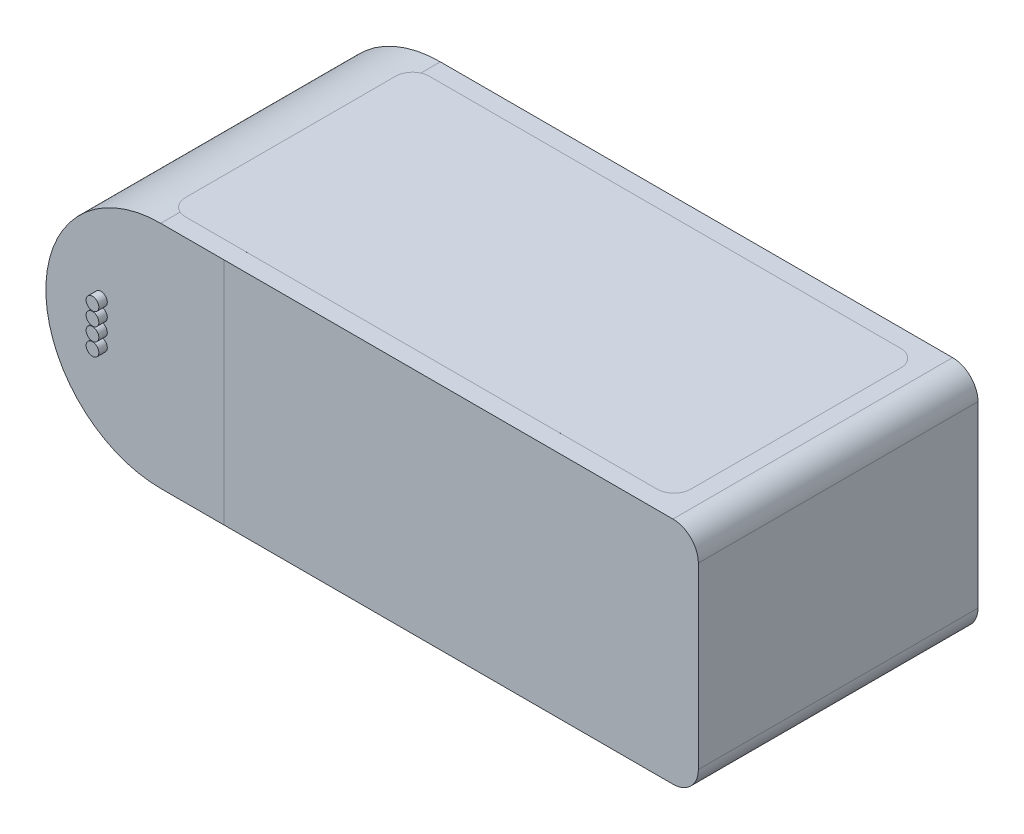
ISO-10303-21;
HEADER;
FILE_DESCRIPTION(('STEP AP214'),'2;1');
FILE_NAME('part.step','',(''),(''),'','','');
FILE_SCHEMA(('AUTOMOTIVE_DESIGN { 1 0 10303 214 1 1 1 1 }'));
ENDSEC;
DATA;
#1=APPLICATION_CONTEXT('core data for automotive mechanical design processes');
#2=APPLICATION_PROTOCOL_DEFINITION('international standard','automotive_design',2000,#1);
#3=PRODUCT_CONTEXT('',#1,'mechanical');
#4=PRODUCT('Part','Part','',(#3));
#5=PRODUCT_RELATED_PRODUCT_CATEGORY('part','',(#4));
#6=PRODUCT_DEFINITION_FORMATION('','',#4);
#7=PRODUCT_DEFINITION_CONTEXT('part definition',#1,'design');
#8=PRODUCT_DEFINITION('design','',#6,#7);
#9=PRODUCT_DEFINITION_SHAPE('','',#8);
#10=(LENGTH_UNIT() NAMED_UNIT(*) SI_UNIT(.MILLI.,.METRE.));
#11=(NAMED_UNIT(*) PLANE_ANGLE_UNIT() SI_UNIT($,.RADIAN.));
#12=(NAMED_UNIT(*) SI_UNIT($,.STERADIAN.) SOLID_ANGLE_UNIT());
#13=UNCERTAINTY_MEASURE_WITH_UNIT(LENGTH_MEASURE(1.E-05),#10,'distance_accuracy_value','');
#14=(GEOMETRIC_REPRESENTATION_CONTEXT(3) GLOBAL_UNCERTAINTY_ASSIGNED_CONTEXT((#13)) GLOBAL_UNIT_ASSIGNED_CONTEXT((#10,
#11,#12)) REPRESENTATION_CONTEXT('',''));
#15=CARTESIAN_POINT('',(0.,0.,0.));
#16=DIRECTION('',(0.,0.,1.));
#17=DIRECTION('',(1.,0.,0.));
#18=AXIS2_PLACEMENT_3D('',#15,#16,#17);
#19=CARTESIAN_POINT('',(0.,13.55,0.));
#20=DIRECTION('',(0.,-1.,0.));
#21=DIRECTION('',(0.,0.,-1.));
#22=AXIS2_PLACEMENT_3D('',#19,#20,#21);
#23=PLANE('',#22);
#24=CARTESIAN_POINT('',(-24.12,13.55,-12.381));
#25=DIRECTION('',(0.,1.,0.));
#26=DIRECTION('',(0.,0.,1.));
#27=AXIS2_PLACEMENT_3D('',#24,#25,#26);
#28=CIRCLE('',#27,2.);
#29=CARTESIAN_POINT('',(-24.12,13.55,-14.381));
#30=VERTEX_POINT('',#29);
#31=CARTESIAN_POINT('',(-24.95,13.55,-14.2006428220945));
#32=VERTEX_POINT('',#31);
#33=EDGE_CURVE('E69',#30,#32,#28,.T.);
#34=ORIENTED_EDGE('',*,*,#33,.F.);
#35=DIRECTION('',(-1.,0.,0.));
#36=VECTOR('',#35,1.);
#37=CARTESIAN_POINT('',(-24.12,13.55,-14.381));
#38=LINE('',#37,#36);
#39=CARTESIAN_POINT('',(31.5,13.55,-14.381));
#40=VERTEX_POINT('',#39);
#41=EDGE_CURVE('E73',#40,#30,#38,.T.);
#42=ORIENTED_EDGE('',*,*,#41,.F.);
#43=CARTESIAN_POINT('',(31.5,13.55,-12.381));
#44=DIRECTION('',(0.,1.,0.));
#45=DIRECTION('',(0.,0.,-1.));
#46=AXIS2_PLACEMENT_3D('',#43,#44,#45);
#47=CIRCLE('',#46,2.);
#48=CARTESIAN_POINT('',(33.5,13.55,-12.381));
#49=VERTEX_POINT('',#48);
#50=EDGE_CURVE('E208',#49,#40,#47,.T.);
#51=ORIENTED_EDGE('',*,*,#50,.F.);
#52=DIRECTION('',(0.,0.,-1.));
#53=VECTOR('',#52,1.);
#54=CARTESIAN_POINT('',(33.5,13.55,-12.381));
#55=LINE('',#54,#53);
#56=CARTESIAN_POINT('',(33.5,13.55,12.381));
#57=VERTEX_POINT('',#56);
#58=EDGE_CURVE('E205',#57,#49,#55,.T.);
#59=ORIENTED_EDGE('',*,*,#58,.F.);
#60=CARTESIAN_POINT('',(31.5,13.55,12.381));
#61=DIRECTION('',(0.,1.,0.));
#62=DIRECTION('',(0.,0.,1.));
#63=AXIS2_PLACEMENT_3D('',#60,#61,#62);
#64=CIRCLE('',#63,2.);
#65=CARTESIAN_POINT('',(31.5,13.55,14.381));
#66=VERTEX_POINT('',#65);
#67=EDGE_CURVE('E421',#66,#57,#64,.T.);
#68=ORIENTED_EDGE('',*,*,#67,.F.);
#69=DIRECTION('',(1.,0.,0.));
#70=VECTOR('',#69,1.);
#71=CARTESIAN_POINT('',(-24.12,13.55,14.381));
#72=LINE('',#71,#70);
#73=CARTESIAN_POINT('',(-24.12,13.55,14.381));
#74=VERTEX_POINT('',#73);
#75=EDGE_CURVE('E417',#74,#66,#72,.T.);
#76=ORIENTED_EDGE('',*,*,#75,.F.);
#77=CARTESIAN_POINT('',(-24.12,13.55,12.381));
#78=DIRECTION('',(0.,-1.,0.));
#79=DIRECTION('',(0.,0.,-1.));
#80=AXIS2_PLACEMENT_3D('',#77,#78,#79);
#81=CIRCLE('',#80,2.);
#82=CARTESIAN_POINT('',(-24.95,13.55,14.2006428220945));
#83=VERTEX_POINT('',#82);
#84=EDGE_CURVE('E11',#83,#74,#81,.F.);
#85=ORIENTED_EDGE('',*,*,#84,.F.);
#86=DIRECTION('',(0.,0.,1.));
#87=VECTOR('',#86,1.);
#88=CARTESIAN_POINT('',(-24.95,13.55,0.));
#89=LINE('',#88,#87);
#90=CARTESIAN_POINT('',(-24.95,13.55,16.501));
#91=VERTEX_POINT('',#90);
#92=EDGE_CURVE('E333',#83,#91,#89,.T.);
#93=ORIENTED_EDGE('',*,*,#92,.T.);
#94=DIRECTION('',(-1.,0.,0.));
#95=VECTOR('',#94,1.);
#96=CARTESIAN_POINT('',(-17.5,13.55,16.501));
#97=LINE('',#96,#95);
#98=CARTESIAN_POINT('',(-17.5,13.55,16.501));
#99=VERTEX_POINT('',#98);
#100=EDGE_CURVE('E256',#99,#91,#97,.T.);
#101=ORIENTED_EDGE('',*,*,#100,.F.);
#102=DIRECTION('',(0.,0.,-1.));
#103=VECTOR('',#102,1.);
#104=CARTESIAN_POINT('',(-17.5,13.55,16.501));
#105=LINE('',#104,#103);
#106=CARTESIAN_POINT('',(-17.5,13.55,16.5));
#107=VERTEX_POINT('',#106);
#108=EDGE_CURVE('E264',#99,#107,#105,.T.);
#109=ORIENTED_EDGE('',*,*,#108,.T.);
#110=DIRECTION('',(1.,0.,0.));
#111=VECTOR('',#110,1.);
#112=CARTESIAN_POINT('',(-38.5,13.55,16.5));
#113=LINE('',#112,#111);
#114=CARTESIAN_POINT('',(35.5,13.55,16.5));
#115=VERTEX_POINT('',#114);
#116=EDGE_CURVE('E317',#107,#115,#113,.T.);
#117=ORIENTED_EDGE('',*,*,#116,.T.);
#118=DIRECTION('',(0.,0.,-1.));
#119=VECTOR('',#118,1.);
#120=CARTESIAN_POINT('',(35.5,13.55,0.));
#121=LINE('',#120,#119);
#122=CARTESIAN_POINT('',(35.5,13.55,-16.5));
#123=VERTEX_POINT('',#122);
#124=EDGE_CURVE('E62',#115,#123,#121,.T.);
#125=ORIENTED_EDGE('',*,*,#124,.T.);
#126=DIRECTION('',(-1.,0.,0.));
#127=VECTOR('',#126,1.);
#128=CARTESIAN_POINT('',(-38.5,13.55,-16.5));
#129=LINE('',#128,#127);
#130=CARTESIAN_POINT('',(-17.5,13.55,-16.5));
#131=VERTEX_POINT('',#130);
#132=EDGE_CURVE('E313',#123,#131,#129,.T.);
#133=ORIENTED_EDGE('',*,*,#132,.T.);
#134=DIRECTION('',(0.,0.,1.));
#135=VECTOR('',#134,1.);
#136=CARTESIAN_POINT('',(-17.5,13.55,-16.501));
#137=LINE('',#136,#135);
#138=CARTESIAN_POINT('',(-17.5,13.55,-16.501));
#139=VERTEX_POINT('',#138);
#140=EDGE_CURVE('E239',#139,#131,#137,.T.);
#141=ORIENTED_EDGE('',*,*,#140,.F.);
#142=DIRECTION('',(-1.,0.,0.));
#143=VECTOR('',#142,1.);
#144=CARTESIAN_POINT('',(-17.5,13.55,-16.501));
#145=LINE('',#144,#143);
#146=CARTESIAN_POINT('',(-24.95,13.55,-16.501));
#147=VERTEX_POINT('',#146);
#148=EDGE_CURVE('E227',#139,#147,#145,.T.);
#149=ORIENTED_EDGE('',*,*,#148,.T.);
#150=EDGE_CURVE('E334',#147,#32,#89,.T.);
#151=ORIENTED_EDGE('',*,*,#150,.T.);
#152=EDGE_LOOP('',(#34,#42,#51,#59,#68,#76,#85,#93,#101,#109,#117,#125,#133,#141,#149,#151));
#153=FACE_BOUND('',#152,.T.);
#154=ADVANCED_FACE('F53',(#153),#23,.F.);
#155=CARTESIAN_POINT('',(-38.5,13.55,16.5));
#156=DIRECTION('',(0.,0.,-1.));
#157=DIRECTION('',(-1.,0.,0.));
#158=AXIS2_PLACEMENT_3D('',#155,#156,#157);
#159=PLANE('',#158);
#160=DIRECTION('',(0.,1.,0.));
#161=VECTOR('',#160,1.);
#162=CARTESIAN_POINT('',(-17.5,-13.55,16.5));
#163=LINE('',#162,#161);
#164=CARTESIAN_POINT('',(-17.5,-13.55,16.5));
#165=VERTEX_POINT('',#164);
#166=EDGE_CURVE('E248',#165,#107,#163,.T.);
#167=ORIENTED_EDGE('',*,*,#166,.F.);
#168=DIRECTION('',(1.,0.,0.));
#169=VECTOR('',#168,1.);
#170=CARTESIAN_POINT('',(-38.5,-13.55,16.5));
#171=LINE('',#170,#169);
#172=CARTESIAN_POINT('',(35.5,-13.55,16.5));
#173=VERTEX_POINT('',#172);
#174=EDGE_CURVE('E318',#165,#173,#171,.T.);
#175=ORIENTED_EDGE('',*,*,#174,.T.);
#176=CARTESIAN_POINT('',(35.5,-10.55,16.5));
#177=DIRECTION('',(0.,0.,-1.));
#178=DIRECTION('',(-1.,0.,0.));
#179=AXIS2_PLACEMENT_3D('',#176,#177,#178);
#180=CIRCLE('',#179,3.);
#181=CARTESIAN_POINT('',(38.5,-10.55,16.5));
#182=VERTEX_POINT('',#181);
#183=EDGE_CURVE('E362',#173,#182,#180,.F.);
#184=ORIENTED_EDGE('',*,*,#183,.T.);
#185=DIRECTION('',(0.,-1.,0.));
#186=VECTOR('',#185,1.);
#187=CARTESIAN_POINT('',(38.5,13.55,16.5));
#188=LINE('',#187,#186);
#189=CARTESIAN_POINT('',(38.5,10.55,16.5));
#190=VERTEX_POINT('',#189);
#191=EDGE_CURVE('E321',#190,#182,#188,.T.);
#192=ORIENTED_EDGE('',*,*,#191,.F.);
#193=CARTESIAN_POINT('',(35.5,10.55,16.5));
#194=DIRECTION('',(0.,0.,-1.));
#195=DIRECTION('',(-1.,0.,0.));
#196=AXIS2_PLACEMENT_3D('',#193,#194,#195);
#197=CIRCLE('',#196,3.);
#198=EDGE_CURVE('E358',#190,#115,#197,.F.);
#199=ORIENTED_EDGE('',*,*,#198,.T.);
#200=ORIENTED_EDGE('',*,*,#116,.F.);
#201=EDGE_LOOP('',(#167,#175,#184,#192,#199,#200));
#202=FACE_BOUND('',#201,.T.);
#203=ADVANCED_FACE('F501',(#202),#159,.F.);
#204=CARTESIAN_POINT('',(-24.95,0.,-16.5));
#205=DIRECTION('',(0.,0.,1.));
#206=DIRECTION('',(1.,0.,0.));
#207=AXIS2_PLACEMENT_3D('',#204,#205,#206);
#208=CYLINDRICAL_SURFACE('',#207,13.55);
#209=ORIENTED_EDGE('',*,*,#150,.F.);
#210=CARTESIAN_POINT('',(-24.95,0.,-16.501));
#211=DIRECTION('',(0.,0.,1.));
#212=DIRECTION('',(1.,0.,0.));
#213=AXIS2_PLACEMENT_3D('',#210,#211,#212);
#214=CIRCLE('',#213,13.55);
#215=CARTESIAN_POINT('',(-24.95,-13.55,-16.501));
#216=VERTEX_POINT('',#215);
#217=EDGE_CURVE('E223',#147,#216,#214,.T.);
#218=ORIENTED_EDGE('',*,*,#217,.T.);
#219=DIRECTION('',(0.,0.,-1.));
#220=VECTOR('',#219,1.);
#221=CARTESIAN_POINT('',(-24.95,-13.55,-16.5));
#222=LINE('',#221,#220);
#223=CARTESIAN_POINT('',(-24.95,-13.55,16.501));
#224=VERTEX_POINT('',#223);
#225=EDGE_CURVE('E337',#224,#216,#222,.T.);
#226=ORIENTED_EDGE('',*,*,#225,.F.);
#227=CARTESIAN_POINT('',(-24.95,0.,16.501));
#228=DIRECTION('',(0.,0.,1.));
#229=DIRECTION('',(1.,0.,0.));
#230=AXIS2_PLACEMENT_3D('',#227,#228,#229);
#231=CIRCLE('',#230,13.55);
#232=EDGE_CURVE('E260',#91,#224,#231,.T.);
#233=ORIENTED_EDGE('',*,*,#232,.F.);
#234=ORIENTED_EDGE('',*,*,#92,.F.);
#235=EDGE_CURVE('E338',#32,#83,#89,.T.);
#236=ORIENTED_EDGE('',*,*,#235,.F.);
#237=EDGE_LOOP('',(#209,#218,#226,#233,#234,#236));
#238=FACE_BOUND('',#237,.T.);
#239=ADVANCED_FACE('F390',(#238),#208,.T.);
#240=CARTESIAN_POINT('',(38.5,13.55,16.5));
#241=DIRECTION('',(-1.,0.,0.));
#242=DIRECTION('',(0.,0.,1.));
#243=AXIS2_PLACEMENT_3D('',#240,#241,#242);
#244=PLANE('',#243);
#245=ORIENTED_EDGE('',*,*,#191,.T.);
#246=DIRECTION('',(0.,0.,-1.));
#247=VECTOR('',#246,1.);
#248=CARTESIAN_POINT('',(38.5,-10.55,-16.5));
#249=LINE('',#248,#247);
#250=CARTESIAN_POINT('',(38.5,-10.55,-16.5));
#251=VERTEX_POINT('',#250);
#252=EDGE_CURVE('E344',#182,#251,#249,.T.);
#253=ORIENTED_EDGE('',*,*,#252,.T.);
#254=DIRECTION('',(0.,-1.,0.));
#255=VECTOR('',#254,1.);
#256=CARTESIAN_POINT('',(38.5,13.55,-16.5));
#257=LINE('',#256,#255);
#258=CARTESIAN_POINT('',(38.5,10.55,-16.5));
#259=VERTEX_POINT('',#258);
#260=EDGE_CURVE('E329',#259,#251,#257,.T.);
#261=ORIENTED_EDGE('',*,*,#260,.F.);
#262=DIRECTION('',(0.,0.,-1.));
#263=VECTOR('',#262,1.);
#264=CARTESIAN_POINT('',(38.5,10.55,16.5));
#265=LINE('',#264,#263);
#266=EDGE_CURVE('E341',#259,#190,#265,.F.);
#267=ORIENTED_EDGE('',*,*,#266,.T.);
#268=EDGE_LOOP('',(#245,#253,#261,#267));
#269=FACE_BOUND('',#268,.T.);
#270=ADVANCED_FACE('F508',(#269),#244,.F.);
#271=CARTESIAN_POINT('',(-38.5,13.55,-16.5));
#272=DIRECTION('',(0.,0.,1.));
#273=DIRECTION('',(1.,0.,0.));
#274=AXIS2_PLACEMENT_3D('',#271,#272,#273);
#275=PLANE('',#274);
#276=DIRECTION('',(-1.,0.,0.));
#277=VECTOR('',#276,1.);
#278=CARTESIAN_POINT('',(-38.5,-13.55,-16.5));
#279=LINE('',#278,#277);
#280=CARTESIAN_POINT('',(35.5,-13.55,-16.5));
#281=VERTEX_POINT('',#280);
#282=CARTESIAN_POINT('',(-17.5,-13.55,-16.5));
#283=VERTEX_POINT('',#282);
#284=EDGE_CURVE('E312',#281,#283,#279,.T.);
#285=ORIENTED_EDGE('',*,*,#284,.T.);
#286=DIRECTION('',(0.,1.,0.));
#287=VECTOR('',#286,1.);
#288=CARTESIAN_POINT('',(-17.5,-13.55,-16.5));
#289=LINE('',#288,#287);
#290=EDGE_CURVE('E210',#283,#131,#289,.T.);
#291=ORIENTED_EDGE('',*,*,#290,.T.);
#292=ORIENTED_EDGE('',*,*,#132,.F.);
#293=CARTESIAN_POINT('',(35.5,10.55,-16.5));
#294=DIRECTION('',(0.,0.,1.));
#295=DIRECTION('',(1.,0.,0.));
#296=AXIS2_PLACEMENT_3D('',#293,#294,#295);
#297=CIRCLE('',#296,3.);
#298=EDGE_CURVE('E348',#123,#259,#297,.F.);
#299=ORIENTED_EDGE('',*,*,#298,.T.);
#300=ORIENTED_EDGE('',*,*,#260,.T.);
#301=CARTESIAN_POINT('',(35.5,-10.55,-16.5));
#302=DIRECTION('',(0.,0.,1.));
#303=DIRECTION('',(1.,0.,0.));
#304=AXIS2_PLACEMENT_3D('',#301,#302,#303);
#305=CIRCLE('',#304,3.);
#306=EDGE_CURVE('E351',#251,#281,#305,.F.);
#307=ORIENTED_EDGE('',*,*,#306,.T.);
#308=EDGE_LOOP('',(#285,#291,#292,#299,#300,#307));
#309=FACE_BOUND('',#308,.T.);
#310=ADVANCED_FACE('F506',(#309),#275,.F.);
#311=CARTESIAN_POINT('',(0.,-13.55,0.));
#312=DIRECTION('',(0.,-1.,0.));
#313=DIRECTION('',(0.,0.,-1.));
#314=AXIS2_PLACEMENT_3D('',#311,#312,#313);
#315=PLANE('',#314);
#316=ORIENTED_EDGE('',*,*,#284,.F.);
#317=DIRECTION('',(0.,0.,-1.));
#318=VECTOR('',#317,1.);
#319=CARTESIAN_POINT('',(35.5,-13.55,16.5));
#320=LINE('',#319,#318);
#321=EDGE_CURVE('E354',#281,#173,#320,.F.);
#322=ORIENTED_EDGE('',*,*,#321,.T.);
#323=ORIENTED_EDGE('',*,*,#174,.F.);
#324=DIRECTION('',(0.,0.,-1.));
#325=VECTOR('',#324,1.);
#326=CARTESIAN_POINT('',(-17.5,-13.55,16.501));
#327=LINE('',#326,#325);
#328=CARTESIAN_POINT('',(-17.5,-13.55,16.501));
#329=VERTEX_POINT('',#328);
#330=EDGE_CURVE('E271',#329,#165,#327,.T.);
#331=ORIENTED_EDGE('',*,*,#330,.F.);
#332=DIRECTION('',(1.,0.,0.));
#333=VECTOR('',#332,1.);
#334=CARTESIAN_POINT('',(-24.95,-13.55,16.501));
#335=LINE('',#334,#333);
#336=EDGE_CURVE('E249',#224,#329,#335,.T.);
#337=ORIENTED_EDGE('',*,*,#336,.F.);
#338=ORIENTED_EDGE('',*,*,#225,.T.);
#339=DIRECTION('',(1.,0.,0.));
#340=VECTOR('',#339,1.);
#341=CARTESIAN_POINT('',(-24.95,-13.55,-16.501));
#342=LINE('',#341,#340);
#343=CARTESIAN_POINT('',(-17.5,-13.55,-16.501));
#344=VERTEX_POINT('',#343);
#345=EDGE_CURVE('E214',#216,#344,#342,.T.);
#346=ORIENTED_EDGE('',*,*,#345,.T.);
#347=DIRECTION('',(0.,0.,1.));
#348=VECTOR('',#347,1.);
#349=CARTESIAN_POINT('',(-17.5,-13.55,-16.501));
#350=LINE('',#349,#348);
#351=EDGE_CURVE('E234',#344,#283,#350,.T.);
#352=ORIENTED_EDGE('',*,*,#351,.T.);
#353=EDGE_LOOP('',(#316,#322,#323,#331,#337,#338,#346,#352));
#354=FACE_BOUND('',#353,.T.);
#355=ADVANCED_FACE('F491',(#354),#315,.T.);
#356=CARTESIAN_POINT('',(35.5,-10.55,16.5));
#357=DIRECTION('',(0.,0.,1.));
#358=DIRECTION('',(1.,0.,0.));
#359=AXIS2_PLACEMENT_3D('',#356,#357,#358);
#360=CYLINDRICAL_SURFACE('',#359,3.);
#361=ORIENTED_EDGE('',*,*,#183,.F.);
#362=ORIENTED_EDGE('',*,*,#321,.F.);
#363=ORIENTED_EDGE('',*,*,#306,.F.);
#364=ORIENTED_EDGE('',*,*,#252,.F.);
#365=EDGE_LOOP('',(#361,#362,#363,#364));
#366=FACE_BOUND('',#365,.T.);
#367=ADVANCED_FACE('F512',(#366),#360,.T.);
#368=CARTESIAN_POINT('',(35.5,10.55,0.));
#369=DIRECTION('',(0.,0.,-1.));
#370=DIRECTION('',(-1.,0.,0.));
#371=AXIS2_PLACEMENT_3D('',#368,#369,#370);
#372=CYLINDRICAL_SURFACE('',#371,3.);
#373=ORIENTED_EDGE('',*,*,#198,.F.);
#374=ORIENTED_EDGE('',*,*,#266,.F.);
#375=ORIENTED_EDGE('',*,*,#298,.F.);
#376=ORIENTED_EDGE('',*,*,#124,.F.);
#377=EDGE_LOOP('',(#373,#374,#375,#376));
#378=FACE_BOUND('',#377,.T.);
#379=ADVANCED_FACE('F55',(#378),#372,.T.);
#380=CARTESIAN_POINT('',(-17.5,-13.55,16.501));
#381=DIRECTION('',(-1.,0.,0.));
#382=DIRECTION('',(0.,0.,1.));
#383=AXIS2_PLACEMENT_3D('',#380,#381,#382);
#384=PLANE('',#383);
#385=ORIENTED_EDGE('',*,*,#166,.T.);
#386=ORIENTED_EDGE('',*,*,#108,.F.);
#387=DIRECTION('',(0.,1.,0.));
#388=VECTOR('',#387,1.);
#389=CARTESIAN_POINT('',(-17.5,-13.55,16.501));
#390=LINE('',#389,#388);
#391=EDGE_CURVE('E253',#329,#99,#390,.T.);
#392=ORIENTED_EDGE('',*,*,#391,.F.);
#393=ORIENTED_EDGE('',*,*,#330,.T.);
#394=EDGE_LOOP('',(#385,#386,#392,#393));
#395=FACE_BOUND('',#394,.T.);
#396=ADVANCED_FACE('F494',(#395),#384,.F.);
#397=CARTESIAN_POINT('',(-24.95,0.,16.501));
#398=DIRECTION('',(0.,0.,1.));
#399=DIRECTION('',(1.,0.,0.));
#400=AXIS2_PLACEMENT_3D('',#397,#398,#399);
#401=PLANE('',#400);
#402=CARTESIAN_POINT('',(-32.,2.325,16.501));
#403=DIRECTION('',(0.,0.,1.));
#404=DIRECTION('',(1.,0.,0.));
#405=AXIS2_PLACEMENT_3D('',#402,#403,#404);
#406=CIRCLE('',#405,0.749999999999984);
#407=CARTESIAN_POINT('',(-31.25,2.325,16.501));
#408=VERTEX_POINT('',#407);
#409=EDGE_CURVE('E284',#408,#408,#406,.T.);
#410=ORIENTED_EDGE('',*,*,#409,.F.);
#411=EDGE_LOOP('',(#410));
#412=FACE_BOUND('',#411,.T.);
#413=CARTESIAN_POINT('',(-32.,0.775,16.501));
#414=DIRECTION('',(0.,0.,1.));
#415=DIRECTION('',(1.,0.,0.));
#416=AXIS2_PLACEMENT_3D('',#413,#414,#415);
#417=CIRCLE('',#416,0.749999999999984);
#418=CARTESIAN_POINT('',(-31.25,0.775,16.501));
#419=VERTEX_POINT('',#418);
#420=EDGE_CURVE('E280',#419,#419,#417,.T.);
#421=ORIENTED_EDGE('',*,*,#420,.F.);
#422=EDGE_LOOP('',(#421));
#423=FACE_BOUND('',#422,.T.);
#424=CARTESIAN_POINT('',(-32.,-0.775,16.501));
#425=DIRECTION('',(0.,0.,1.));
#426=DIRECTION('',(1.,0.,0.));
#427=AXIS2_PLACEMENT_3D('',#424,#425,#426);
#428=CIRCLE('',#427,0.749999999999984);
#429=CARTESIAN_POINT('',(-31.25,-0.775,16.501));
#430=VERTEX_POINT('',#429);
#431=EDGE_CURVE('E276',#430,#430,#428,.T.);
#432=ORIENTED_EDGE('',*,*,#431,.F.);
#433=EDGE_LOOP('',(#432));
#434=FACE_BOUND('',#433,.T.);
#435=CARTESIAN_POINT('',(-32.,-2.325,16.501));
#436=DIRECTION('',(0.,0.,1.));
#437=DIRECTION('',(1.,0.,0.));
#438=AXIS2_PLACEMENT_3D('',#435,#436,#437);
#439=CIRCLE('',#438,0.749999999999984);
#440=CARTESIAN_POINT('',(-31.25,-2.325,16.501));
#441=VERTEX_POINT('',#440);
#442=EDGE_CURVE('E275',#441,#441,#439,.T.);
#443=ORIENTED_EDGE('',*,*,#442,.F.);
#444=EDGE_LOOP('',(#443));
#445=FACE_BOUND('',#444,.T.);
#446=ORIENTED_EDGE('',*,*,#336,.T.);
#447=ORIENTED_EDGE('',*,*,#391,.T.);
#448=ORIENTED_EDGE('',*,*,#100,.T.);
#449=ORIENTED_EDGE('',*,*,#232,.T.);
#450=EDGE_LOOP('',(#446,#447,#448,#449));
#451=FACE_BOUND('',#450,.T.);
#452=ADVANCED_FACE('F488',(#412,#423,#434,#445,#451),#401,.T.);
#453=CARTESIAN_POINT('',(-32.,-0.775,17.5));
#454=DIRECTION('',(0.,0.,1.));
#455=DIRECTION('',(1.,0.,0.));
#456=AXIS2_PLACEMENT_3D('',#453,#454,#455);
#457=PLANE('',#456);
#458=CARTESIAN_POINT('',(-32.,-0.775,17.5));
#459=DIRECTION('',(0.,0.,1.));
#460=DIRECTION('',(1.,0.,0.));
#461=AXIS2_PLACEMENT_3D('',#458,#459,#460);
#462=CIRCLE('',#461,0.749999999999984);
#463=CARTESIAN_POINT('',(-31.25,-0.775,17.5));
#464=VERTEX_POINT('',#463);
#465=EDGE_CURVE('E300',#464,#464,#462,.T.);
#466=ORIENTED_EDGE('',*,*,#465,.T.);
#467=EDGE_LOOP('',(#466));
#468=FACE_BOUND('',#467,.T.);
#469=ADVANCED_FACE('F564',(#468),#457,.T.);
#470=CARTESIAN_POINT('',(-32.,-0.775,17.5));
#471=DIRECTION('',(0.,0.,-1.));
#472=DIRECTION('',(-1.,0.,0.));
#473=AXIS2_PLACEMENT_3D('',#470,#471,#472);
#474=CYLINDRICAL_SURFACE('',#473,0.749999999999984);
#475=ORIENTED_EDGE('',*,*,#431,.T.);
#476=EDGE_LOOP('',(#475));
#477=FACE_BOUND('',#476,.T.);
#478=ORIENTED_EDGE('',*,*,#465,.F.);
#479=EDGE_LOOP('',(#478));
#480=FACE_BOUND('',#479,.T.);
#481=ADVANCED_FACE('F583',(#477,#480),#474,.T.);
#482=CARTESIAN_POINT('',(-32.,0.775,17.5));
#483=DIRECTION('',(0.,0.,1.));
#484=DIRECTION('',(1.,0.,0.));
#485=AXIS2_PLACEMENT_3D('',#482,#483,#484);
#486=PLANE('',#485);
#487=CARTESIAN_POINT('',(-32.,0.775,17.5));
#488=DIRECTION('',(0.,0.,1.));
#489=DIRECTION('',(1.,0.,0.));
#490=AXIS2_PLACEMENT_3D('',#487,#488,#489);
#491=CIRCLE('',#490,0.749999999999984);
#492=CARTESIAN_POINT('',(-31.25,0.775,17.5));
#493=VERTEX_POINT('',#492);
#494=EDGE_CURVE('E304',#493,#493,#491,.T.);
#495=ORIENTED_EDGE('',*,*,#494,.T.);
#496=EDGE_LOOP('',(#495));
#497=FACE_BOUND('',#496,.T.);
#498=ADVANCED_FACE('F586',(#497),#486,.T.);
#499=CARTESIAN_POINT('',(-32.,0.775,17.5));
#500=DIRECTION('',(0.,0.,-1.));
#501=DIRECTION('',(-1.,0.,0.));
#502=AXIS2_PLACEMENT_3D('',#499,#500,#501);
#503=CYLINDRICAL_SURFACE('',#502,0.749999999999984);
#504=ORIENTED_EDGE('',*,*,#420,.T.);
#505=EDGE_LOOP('',(#504));
#506=FACE_BOUND('',#505,.T.);
#507=ORIENTED_EDGE('',*,*,#494,.F.);
#508=EDGE_LOOP('',(#507));
#509=FACE_BOUND('',#508,.T.);
#510=ADVANCED_FACE('F591',(#506,#509),#503,.T.);
#511=CARTESIAN_POINT('',(-32.,2.325,17.5));
#512=DIRECTION('',(0.,0.,1.));
#513=DIRECTION('',(1.,0.,0.));
#514=AXIS2_PLACEMENT_3D('',#511,#512,#513);
#515=PLANE('',#514);
#516=CARTESIAN_POINT('',(-32.,2.325,17.5));
#517=DIRECTION('',(0.,0.,1.));
#518=DIRECTION('',(1.,0.,0.));
#519=AXIS2_PLACEMENT_3D('',#516,#517,#518);
#520=CIRCLE('',#519,0.749999999999984);
#521=CARTESIAN_POINT('',(-31.25,2.325,17.5));
#522=VERTEX_POINT('',#521);
#523=EDGE_CURVE('E308',#522,#522,#520,.T.);
#524=ORIENTED_EDGE('',*,*,#523,.T.);
#525=EDGE_LOOP('',(#524));
#526=FACE_BOUND('',#525,.T.);
#527=ADVANCED_FACE('F594',(#526),#515,.T.);
#528=CARTESIAN_POINT('',(-32.,2.325,17.5));
#529=DIRECTION('',(0.,0.,-1.));
#530=DIRECTION('',(-1.,0.,0.));
#531=AXIS2_PLACEMENT_3D('',#528,#529,#530);
#532=CYLINDRICAL_SURFACE('',#531,0.749999999999984);
#533=ORIENTED_EDGE('',*,*,#409,.T.);
#534=EDGE_LOOP('',(#533));
#535=FACE_BOUND('',#534,.T.);
#536=ORIENTED_EDGE('',*,*,#523,.F.);
#537=EDGE_LOOP('',(#536));
#538=FACE_BOUND('',#537,.T.);
#539=ADVANCED_FACE('F538',(#535,#538),#532,.T.);
#540=CARTESIAN_POINT('',(-32.,-2.325,17.5));
#541=DIRECTION('',(0.,0.,1.));
#542=DIRECTION('',(1.,0.,0.));
#543=AXIS2_PLACEMENT_3D('',#540,#541,#542);
#544=PLANE('',#543);
#545=CARTESIAN_POINT('',(-32.,-2.325,17.5));
#546=DIRECTION('',(0.,0.,1.));
#547=DIRECTION('',(1.,0.,0.));
#548=AXIS2_PLACEMENT_3D('',#545,#546,#547);
#549=CIRCLE('',#548,0.749999999999984);
#550=CARTESIAN_POINT('',(-31.25,-2.325,17.5));
#551=VERTEX_POINT('',#550);
#552=EDGE_CURVE('E296',#551,#551,#549,.T.);
#553=ORIENTED_EDGE('',*,*,#552,.T.);
#554=EDGE_LOOP('',(#553));
#555=FACE_BOUND('',#554,.T.);
#556=ADVANCED_FACE('F524',(#555),#544,.T.);
#557=CARTESIAN_POINT('',(-32.,-2.325,17.5));
#558=DIRECTION('',(0.,0.,-1.));
#559=DIRECTION('',(-1.,0.,0.));
#560=AXIS2_PLACEMENT_3D('',#557,#558,#559);
#561=CYLINDRICAL_SURFACE('',#560,0.749999999999984);
#562=ORIENTED_EDGE('',*,*,#442,.T.);
#563=EDGE_LOOP('',(#562));
#564=FACE_BOUND('',#563,.T.);
#565=ORIENTED_EDGE('',*,*,#552,.F.);
#566=EDGE_LOOP('',(#565));
#567=FACE_BOUND('',#566,.T.);
#568=ADVANCED_FACE('F517',(#564,#567),#561,.T.);
#569=CARTESIAN_POINT('',(-17.5,-13.55,-16.501));
#570=DIRECTION('',(1.,0.,0.));
#571=DIRECTION('',(0.,0.,-1.));
#572=AXIS2_PLACEMENT_3D('',#569,#570,#571);
#573=PLANE('',#572);
#574=ORIENTED_EDGE('',*,*,#290,.F.);
#575=ORIENTED_EDGE('',*,*,#351,.F.);
#576=DIRECTION('',(0.,1.,0.));
#577=VECTOR('',#576,1.);
#578=CARTESIAN_POINT('',(-17.5,-13.55,-16.501));
#579=LINE('',#578,#577);
#580=EDGE_CURVE('E231',#344,#139,#579,.T.);
#581=ORIENTED_EDGE('',*,*,#580,.T.);
#582=ORIENTED_EDGE('',*,*,#140,.T.);
#583=EDGE_LOOP('',(#574,#575,#581,#582));
#584=FACE_BOUND('',#583,.T.);
#585=ADVANCED_FACE('F381',(#584),#573,.T.);
#586=CARTESIAN_POINT('',(-24.95,0.,-16.501));
#587=DIRECTION('',(0.,0.,-1.));
#588=DIRECTION('',(1.,0.,0.));
#589=AXIS2_PLACEMENT_3D('',#586,#587,#588);
#590=PLANE('',#589);
#591=CARTESIAN_POINT('',(-32.,2.325,-16.501));
#592=DIRECTION('',(0.,0.,-1.));
#593=DIRECTION('',(-1.,0.,0.));
#594=AXIS2_PLACEMENT_3D('',#591,#592,#593);
#595=CIRCLE('',#594,2.04999999999999);
#596=CARTESIAN_POINT('',(-34.05,2.325,-16.501));
#597=VERTEX_POINT('',#596);
#598=EDGE_CURVE('E244',#597,#597,#595,.T.);
#599=ORIENTED_EDGE('',*,*,#598,.F.);
#600=EDGE_LOOP('',(#599));
#601=FACE_BOUND('',#600,.T.);
#602=CARTESIAN_POINT('',(-32.,-2.325,-16.501));
#603=DIRECTION('',(0.,0.,-1.));
#604=DIRECTION('',(-1.,0.,0.));
#605=AXIS2_PLACEMENT_3D('',#602,#603,#604);
#606=CIRCLE('',#605,2.04999999999999);
#607=CARTESIAN_POINT('',(-34.05,-2.325,-16.501));
#608=VERTEX_POINT('',#607);
#609=EDGE_CURVE('E243',#608,#608,#606,.T.);
#610=ORIENTED_EDGE('',*,*,#609,.F.);
#611=EDGE_LOOP('',(#610));
#612=FACE_BOUND('',#611,.T.);
#613=ORIENTED_EDGE('',*,*,#345,.F.);
#614=ORIENTED_EDGE('',*,*,#217,.F.);
#615=ORIENTED_EDGE('',*,*,#148,.F.);
#616=ORIENTED_EDGE('',*,*,#580,.F.);
#617=EDGE_LOOP('',(#613,#614,#615,#616));
#618=FACE_BOUND('',#617,.T.);
#619=ADVANCED_FACE('F377',(#601,#612,#618),#590,.T.);
#620=CARTESIAN_POINT('',(-32.,2.325,-18.5));
#621=DIRECTION('',(0.,0.,-1.));
#622=DIRECTION('',(-1.,0.,0.));
#623=AXIS2_PLACEMENT_3D('',#620,#621,#622);
#624=PLANE('',#623);
#625=CARTESIAN_POINT('',(-32.,2.325,-18.5));
#626=DIRECTION('',(0.,0.,-1.));
#627=DIRECTION('',(-1.,0.,0.));
#628=AXIS2_PLACEMENT_3D('',#625,#626,#627);
#629=CIRCLE('',#628,2.04999999999999);
#630=CARTESIAN_POINT('',(-34.05,2.325,-18.5));
#631=VERTEX_POINT('',#630);
#632=EDGE_CURVE('E292',#631,#631,#629,.T.);
#633=ORIENTED_EDGE('',*,*,#632,.T.);
#634=EDGE_LOOP('',(#633));
#635=FACE_BOUND('',#634,.T.);
#636=ADVANCED_FACE('F380',(#635),#624,.T.);
#637=CARTESIAN_POINT('',(-32.,2.325,-18.5));
#638=DIRECTION('',(0.,0.,1.));
#639=DIRECTION('',(1.,0.,0.));
#640=AXIS2_PLACEMENT_3D('',#637,#638,#639);
#641=CYLINDRICAL_SURFACE('',#640,2.04999999999999);
#642=ORIENTED_EDGE('',*,*,#598,.T.);
#643=EDGE_LOOP('',(#642));
#644=FACE_BOUND('',#643,.T.);
#645=ORIENTED_EDGE('',*,*,#632,.F.);
#646=EDGE_LOOP('',(#645));
#647=FACE_BOUND('',#646,.T.);
#648=ADVANCED_FACE('F572',(#644,#647),#641,.T.);
#649=CARTESIAN_POINT('',(-32.,-2.325,-18.5));
#650=DIRECTION('',(0.,0.,1.));
#651=DIRECTION('',(1.,0.,0.));
#652=AXIS2_PLACEMENT_3D('',#649,#650,#651);
#653=PLANE('',#652);
#654=CARTESIAN_POINT('',(-32.,-2.325,-18.5));
#655=DIRECTION('',(0.,0.,-1.));
#656=DIRECTION('',(1.,0.,0.));
#657=AXIS2_PLACEMENT_3D('',#654,#655,#656);
#658=CIRCLE('',#657,2.04999999999999);
#659=CARTESIAN_POINT('',(-29.95,-2.325,-18.5));
#660=VERTEX_POINT('',#659);
#661=EDGE_CURVE('E288',#660,#660,#658,.T.);
#662=ORIENTED_EDGE('',*,*,#661,.T.);
#663=EDGE_LOOP('',(#662));
#664=FACE_BOUND('',#663,.T.);
#665=ADVANCED_FACE('F569',(#664),#653,.F.);
#666=CARTESIAN_POINT('',(-32.,-2.325,-18.5));
#667=DIRECTION('',(0.,0.,1.));
#668=DIRECTION('',(1.,0.,0.));
#669=AXIS2_PLACEMENT_3D('',#666,#667,#668);
#670=CYLINDRICAL_SURFACE('',#669,2.04999999999999);
#671=ORIENTED_EDGE('',*,*,#609,.T.);
#672=EDGE_LOOP('',(#671));
#673=FACE_BOUND('',#672,.T.);
#674=ORIENTED_EDGE('',*,*,#661,.F.);
#675=EDGE_LOOP('',(#674));
#676=FACE_BOUND('',#675,.T.);
#677=ADVANCED_FACE('F374',(#673,#676),#670,.T.);
#678=CARTESIAN_POINT('',(31.5,13.55,-12.381));
#679=DIRECTION('',(0.,-1.,0.));
#680=DIRECTION('',(0.,0.,-1.));
#681=AXIS2_PLACEMENT_3D('',#678,#679,#680);
#682=PLANE('',#681);
#683=ORIENTED_EDGE('',*,*,#235,.T.);
#684=CARTESIAN_POINT('',(-24.12,13.55,12.381));
#685=DIRECTION('',(0.,1.,0.));
#686=DIRECTION('',(0.,0.,1.));
#687=AXIS2_PLACEMENT_3D('',#684,#685,#686);
#688=CIRCLE('',#687,2.);
#689=CARTESIAN_POINT('',(-26.12,13.55,12.381));
#690=VERTEX_POINT('',#689);
#691=EDGE_CURVE('E410',#690,#83,#688,.T.);
#692=ORIENTED_EDGE('',*,*,#691,.F.);
#693=DIRECTION('',(0.,0.,1.));
#694=VECTOR('',#693,1.);
#695=CARTESIAN_POINT('',(-26.12,13.55,-12.381));
#696=LINE('',#695,#694);
#697=CARTESIAN_POINT('',(-26.12,13.55,-12.381));
#698=VERTEX_POINT('',#697);
#699=EDGE_CURVE('E401',#698,#690,#696,.T.);
#700=ORIENTED_EDGE('',*,*,#699,.F.);
#701=EDGE_CURVE('E397',#32,#698,#28,.T.);
#702=ORIENTED_EDGE('',*,*,#701,.F.);
#703=EDGE_LOOP('',(#683,#692,#700,#702));
#704=FACE_BOUND('',#703,.T.);
#705=ADVANCED_FACE('F398',(#704),#682,.T.);
#706=CARTESIAN_POINT('',(31.5,13.5501,-12.381));
#707=DIRECTION('',(0.,-1.,0.));
#708=DIRECTION('',(0.,0.,-1.));
#709=AXIS2_PLACEMENT_3D('',#706,#707,#708);
#710=CYLINDRICAL_SURFACE('',#709,2.);
#711=ORIENTED_EDGE('',*,*,#50,.T.);
#712=DIRECTION('',(0.,-1.,0.));
#713=VECTOR('',#712,1.);
#714=CARTESIAN_POINT('',(31.5,13.5501,-14.381));
#715=LINE('',#714,#713);
#716=CARTESIAN_POINT('',(31.5,13.5501,-14.381));
#717=VERTEX_POINT('',#716);
#718=EDGE_CURVE('E187',#717,#40,#715,.T.);
#719=ORIENTED_EDGE('',*,*,#718,.F.);
#720=CARTESIAN_POINT('',(31.5,13.5501,-12.381));
#721=DIRECTION('',(0.,1.,0.));
#722=DIRECTION('',(0.,0.,-1.));
#723=AXIS2_PLACEMENT_3D('',#720,#721,#722);
#724=CIRCLE('',#723,2.);
#725=CARTESIAN_POINT('',(33.5,13.5501,-12.381));
#726=VERTEX_POINT('',#725);
#727=EDGE_CURVE('E195',#726,#717,#724,.T.);
#728=ORIENTED_EDGE('',*,*,#727,.F.);
#729=DIRECTION('',(0.,-1.,0.));
#730=VECTOR('',#729,1.);
#731=CARTESIAN_POINT('',(33.5,13.5501,-12.381));
#732=LINE('',#731,#730);
#733=EDGE_CURVE('E428',#726,#49,#732,.T.);
#734=ORIENTED_EDGE('',*,*,#733,.T.);
#735=EDGE_LOOP('',(#711,#719,#728,#734));
#736=FACE_BOUND('',#735,.T.);
#737=ADVANCED_FACE('F207',(#736),#710,.T.);
#738=CARTESIAN_POINT('',(-24.12,13.5501,-14.381));
#739=DIRECTION('',(0.,0.,1.));
#740=DIRECTION('',(1.,0.,0.));
#741=AXIS2_PLACEMENT_3D('',#738,#739,#740);
#742=PLANE('',#741);
#743=ORIENTED_EDGE('',*,*,#41,.T.);
#744=DIRECTION('',(0.,-1.,0.));
#745=VECTOR('',#744,1.);
#746=CARTESIAN_POINT('',(-24.12,13.5501,-14.381));
#747=LINE('',#746,#745);
#748=CARTESIAN_POINT('',(-24.12,13.5501,-14.381));
#749=VERTEX_POINT('',#748);
#750=EDGE_CURVE('E190',#749,#30,#747,.T.);
#751=ORIENTED_EDGE('',*,*,#750,.F.);
#752=DIRECTION('',(-1.,0.,0.));
#753=VECTOR('',#752,1.);
#754=CARTESIAN_POINT('',(-24.12,13.5501,-14.381));
#755=LINE('',#754,#753);
#756=EDGE_CURVE('E183',#717,#749,#755,.T.);
#757=ORIENTED_EDGE('',*,*,#756,.F.);
#758=ORIENTED_EDGE('',*,*,#718,.T.);
#759=EDGE_LOOP('',(#743,#751,#757,#758));
#760=FACE_BOUND('',#759,.T.);
#761=ADVANCED_FACE('F185',(#760),#742,.F.);
#762=CARTESIAN_POINT('',(-24.12,13.5501,-12.381));
#763=DIRECTION('',(0.,-1.,0.));
#764=DIRECTION('',(0.,0.,-1.));
#765=AXIS2_PLACEMENT_3D('',#762,#763,#764);
#766=CYLINDRICAL_SURFACE('',#765,2.);
#767=ORIENTED_EDGE('',*,*,#33,.T.);
#768=ORIENTED_EDGE('',*,*,#701,.T.);
#769=DIRECTION('',(0.,-1.,0.));
#770=VECTOR('',#769,1.);
#771=CARTESIAN_POINT('',(-26.12,13.5501,-12.381));
#772=LINE('',#771,#770);
#773=CARTESIAN_POINT('',(-26.12,13.5501,-12.381));
#774=VERTEX_POINT('',#773);
#775=EDGE_CURVE('E216',#774,#698,#772,.T.);
#776=ORIENTED_EDGE('',*,*,#775,.F.);
#777=CARTESIAN_POINT('',(-24.12,13.5501,-12.381));
#778=DIRECTION('',(0.,1.,0.));
#779=DIRECTION('',(0.,0.,1.));
#780=AXIS2_PLACEMENT_3D('',#777,#778,#779);
#781=CIRCLE('',#780,2.);
#782=EDGE_CURVE('E194',#749,#774,#781,.T.);
#783=ORIENTED_EDGE('',*,*,#782,.F.);
#784=ORIENTED_EDGE('',*,*,#750,.T.);
#785=EDGE_LOOP('',(#767,#768,#776,#783,#784));
#786=FACE_BOUND('',#785,.T.);
#787=ADVANCED_FACE('F407',(#786),#766,.T.);
#788=CARTESIAN_POINT('',(-26.12,13.5501,-12.381));
#789=DIRECTION('',(1.,0.,0.));
#790=DIRECTION('',(0.,0.,-1.));
#791=AXIS2_PLACEMENT_3D('',#788,#789,#790);
#792=PLANE('',#791);
#793=ORIENTED_EDGE('',*,*,#699,.T.);
#794=DIRECTION('',(0.,-1.,0.));
#795=VECTOR('',#794,1.);
#796=CARTESIAN_POINT('',(-26.12,13.5501,12.381));
#797=LINE('',#796,#795);
#798=CARTESIAN_POINT('',(-26.12,13.5501,12.381));
#799=VERTEX_POINT('',#798);
#800=EDGE_CURVE('E443',#799,#690,#797,.T.);
#801=ORIENTED_EDGE('',*,*,#800,.F.);
#802=DIRECTION('',(0.,0.,1.));
#803=VECTOR('',#802,1.);
#804=CARTESIAN_POINT('',(-26.12,13.5501,-12.381));
#805=LINE('',#804,#803);
#806=EDGE_CURVE('E451',#774,#799,#805,.T.);
#807=ORIENTED_EDGE('',*,*,#806,.F.);
#808=ORIENTED_EDGE('',*,*,#775,.T.);
#809=EDGE_LOOP('',(#793,#801,#807,#808));
#810=FACE_BOUND('',#809,.T.);
#811=ADVANCED_FACE('F449',(#810),#792,.F.);
#812=CARTESIAN_POINT('',(-24.12,13.5501,12.381));
#813=DIRECTION('',(0.,-1.,0.));
#814=DIRECTION('',(0.,0.,-1.));
#815=AXIS2_PLACEMENT_3D('',#812,#813,#814);
#816=CYLINDRICAL_SURFACE('',#815,2.);
#817=ORIENTED_EDGE('',*,*,#691,.T.);
#818=ORIENTED_EDGE('',*,*,#84,.T.);
#819=DIRECTION('',(0.,-1.,0.));
#820=VECTOR('',#819,1.);
#821=CARTESIAN_POINT('',(-24.12,13.5501,14.381));
#822=LINE('',#821,#820);
#823=CARTESIAN_POINT('',(-24.12,13.5501,14.381));
#824=VERTEX_POINT('',#823);
#825=EDGE_CURVE('E439',#824,#74,#822,.T.);
#826=ORIENTED_EDGE('',*,*,#825,.F.);
#827=CARTESIAN_POINT('',(-24.12,13.5501,12.381));
#828=DIRECTION('',(0.,1.,0.));
#829=DIRECTION('',(0.,0.,1.));
#830=AXIS2_PLACEMENT_3D('',#827,#828,#829);
#831=CIRCLE('',#830,2.);
#832=EDGE_CURVE('E455',#799,#824,#831,.T.);
#833=ORIENTED_EDGE('',*,*,#832,.F.);
#834=ORIENTED_EDGE('',*,*,#800,.T.);
#835=EDGE_LOOP('',(#817,#818,#826,#833,#834));
#836=FACE_BOUND('',#835,.T.);
#837=ADVANCED_FACE('F482',(#836),#816,.T.);
#838=CARTESIAN_POINT('',(-24.12,13.5501,14.381));
#839=DIRECTION('',(0.,0.,-1.));
#840=DIRECTION('',(-1.,0.,0.));
#841=AXIS2_PLACEMENT_3D('',#838,#839,#840);
#842=PLANE('',#841);
#843=ORIENTED_EDGE('',*,*,#75,.T.);
#844=DIRECTION('',(0.,-1.,0.));
#845=VECTOR('',#844,1.);
#846=CARTESIAN_POINT('',(31.5,13.5501,14.381));
#847=LINE('',#846,#845);
#848=CARTESIAN_POINT('',(31.5,13.5501,14.381));
#849=VERTEX_POINT('',#848);
#850=EDGE_CURVE('E435',#849,#66,#847,.T.);
#851=ORIENTED_EDGE('',*,*,#850,.F.);
#852=DIRECTION('',(1.,0.,0.));
#853=VECTOR('',#852,1.);
#854=CARTESIAN_POINT('',(-24.12,13.5501,14.381));
#855=LINE('',#854,#853);
#856=EDGE_CURVE('E460',#824,#849,#855,.T.);
#857=ORIENTED_EDGE('',*,*,#856,.F.);
#858=ORIENTED_EDGE('',*,*,#825,.T.);
#859=EDGE_LOOP('',(#843,#851,#857,#858));
#860=FACE_BOUND('',#859,.T.);
#861=ADVANCED_FACE('F478',(#860),#842,.F.);
#862=CARTESIAN_POINT('',(31.5,13.5501,12.381));
#863=DIRECTION('',(0.,-1.,0.));
#864=DIRECTION('',(0.,0.,-1.));
#865=AXIS2_PLACEMENT_3D('',#862,#863,#864);
#866=CYLINDRICAL_SURFACE('',#865,2.);
#867=ORIENTED_EDGE('',*,*,#67,.T.);
#868=DIRECTION('',(0.,-1.,0.));
#869=VECTOR('',#868,1.);
#870=CARTESIAN_POINT('',(33.5,13.5501,12.381));
#871=LINE('',#870,#869);
#872=CARTESIAN_POINT('',(33.5,13.5501,12.381));
#873=VERTEX_POINT('',#872);
#874=EDGE_CURVE('E431',#873,#57,#871,.T.);
#875=ORIENTED_EDGE('',*,*,#874,.F.);
#876=CARTESIAN_POINT('',(31.5,13.5501,12.381));
#877=DIRECTION('',(0.,1.,0.));
#878=DIRECTION('',(0.,0.,1.));
#879=AXIS2_PLACEMENT_3D('',#876,#877,#878);
#880=CIRCLE('',#879,2.);
#881=EDGE_CURVE('E463',#849,#873,#880,.T.);
#882=ORIENTED_EDGE('',*,*,#881,.F.);
#883=ORIENTED_EDGE('',*,*,#850,.T.);
#884=EDGE_LOOP('',(#867,#875,#882,#883));
#885=FACE_BOUND('',#884,.T.);
#886=ADVANCED_FACE('F474',(#885),#866,.T.);
#887=CARTESIAN_POINT('',(33.5,13.5501,-12.381));
#888=DIRECTION('',(-1.,0.,0.));
#889=DIRECTION('',(0.,0.,1.));
#890=AXIS2_PLACEMENT_3D('',#887,#888,#889);
#891=PLANE('',#890);
#892=ORIENTED_EDGE('',*,*,#58,.T.);
#893=ORIENTED_EDGE('',*,*,#733,.F.);
#894=DIRECTION('',(0.,0.,-1.));
#895=VECTOR('',#894,1.);
#896=CARTESIAN_POINT('',(33.5,13.5501,-12.381));
#897=LINE('',#896,#895);
#898=EDGE_CURVE('E200',#873,#726,#897,.T.);
#899=ORIENTED_EDGE('',*,*,#898,.F.);
#900=ORIENTED_EDGE('',*,*,#874,.T.);
#901=EDGE_LOOP('',(#892,#893,#899,#900));
#902=FACE_BOUND('',#901,.T.);
#903=ADVANCED_FACE('F476',(#902),#891,.F.);
#904=CARTESIAN_POINT('',(31.5,13.5501,-12.381));
#905=DIRECTION('',(0.,-1.,0.));
#906=DIRECTION('',(0.,0.,-1.));
#907=AXIS2_PLACEMENT_3D('',#904,#905,#906);
#908=PLANE('',#907);
#909=ORIENTED_EDGE('',*,*,#727,.T.);
#910=ORIENTED_EDGE('',*,*,#756,.T.);
#911=ORIENTED_EDGE('',*,*,#782,.T.);
#912=ORIENTED_EDGE('',*,*,#806,.T.);
#913=ORIENTED_EDGE('',*,*,#832,.T.);
#914=ORIENTED_EDGE('',*,*,#856,.T.);
#915=ORIENTED_EDGE('',*,*,#881,.T.);
#916=ORIENTED_EDGE('',*,*,#898,.T.);
#917=EDGE_LOOP('',(#909,#910,#911,#912,#913,#914,#915,#916));
#918=FACE_BOUND('',#917,.T.);
#919=ADVANCED_FACE('F198',(#918),#908,.F.);
#920=CLOSED_SHELL('',(#154,#203,#239,#270,#310,#355,#367,#379,#396,#452,#469,#481,#498,#510,
#527,#539,#556,#568,#585,#619,#636,#648,#665,#677,#705,#737,#761,#787,#811,#837,#861,#886,#903,#919));
#921=MANIFOLD_SOLID_BREP('B2',#920);
#922=ADVANCED_BREP_SHAPE_REPRESENTATION('',(#18,#921),#14);
#923=SHAPE_DEFINITION_REPRESENTATION(#9,#922);
ENDSEC;
END-ISO-10303-21;
